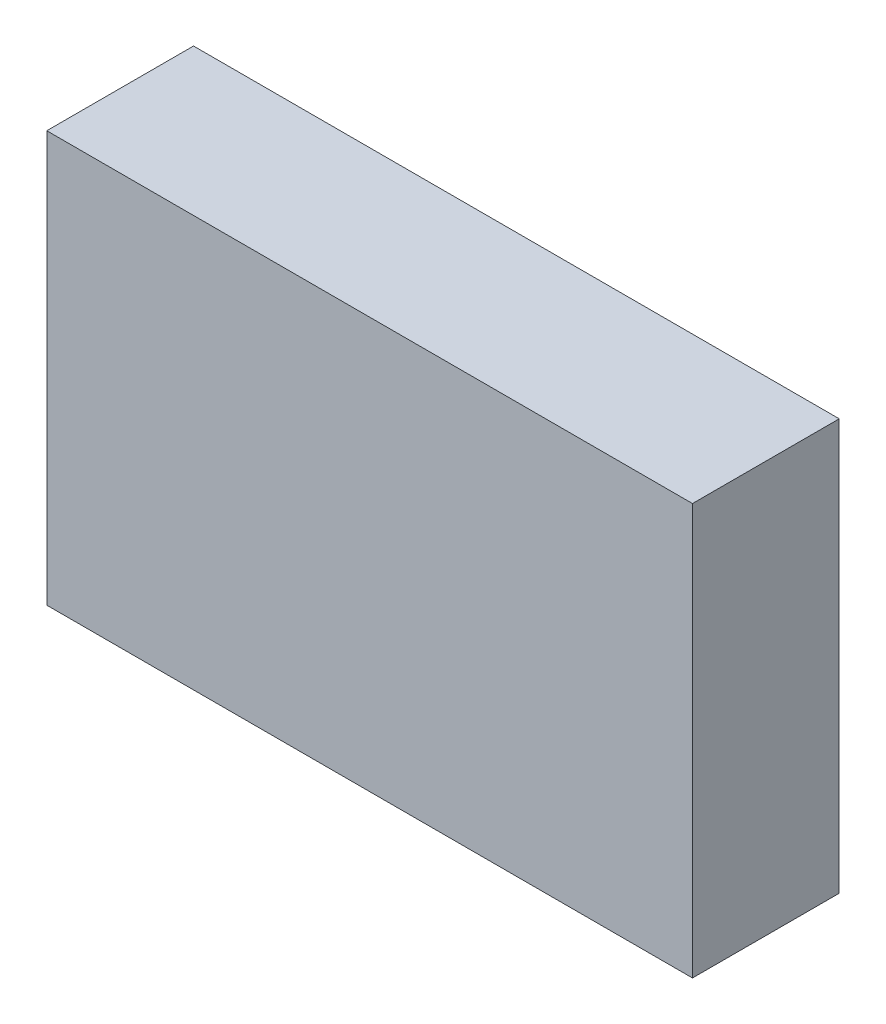
ISO-10303-21;
HEADER;
FILE_DESCRIPTION(('STEP AP214'),'2;1');
FILE_NAME('part.step','',(''),(''),'','','');
FILE_SCHEMA(('AUTOMOTIVE_DESIGN { 1 0 10303 214 1 1 1 1 }'));
ENDSEC;
DATA;
#1=APPLICATION_CONTEXT('core data for automotive mechanical design processes');
#2=APPLICATION_PROTOCOL_DEFINITION('international standard','automotive_design',2000,#1);
#3=PRODUCT_CONTEXT('',#1,'mechanical');
#4=PRODUCT('Part','Part','',(#3));
#5=PRODUCT_RELATED_PRODUCT_CATEGORY('part','',(#4));
#6=PRODUCT_DEFINITION_FORMATION('','',#4);
#7=PRODUCT_DEFINITION_CONTEXT('part definition',#1,'design');
#8=PRODUCT_DEFINITION('design','',#6,#7);
#9=PRODUCT_DEFINITION_SHAPE('','',#8);
#10=(LENGTH_UNIT() NAMED_UNIT(*) SI_UNIT(.MILLI.,.METRE.));
#11=(NAMED_UNIT(*) PLANE_ANGLE_UNIT() SI_UNIT($,.RADIAN.));
#12=(NAMED_UNIT(*) SI_UNIT($,.STERADIAN.) SOLID_ANGLE_UNIT());
#13=UNCERTAINTY_MEASURE_WITH_UNIT(LENGTH_MEASURE(1.E-05),#10,'distance_accuracy_value','');
#14=(GEOMETRIC_REPRESENTATION_CONTEXT(3) GLOBAL_UNCERTAINTY_ASSIGNED_CONTEXT((#13)) GLOBAL_UNIT_ASSIGNED_CONTEXT((#10,
#11,#12)) REPRESENTATION_CONTEXT('',''));
#15=CARTESIAN_POINT('',(0.,0.,0.));
#16=DIRECTION('',(0.,0.,1.));
#17=DIRECTION('',(1.,0.,0.));
#18=AXIS2_PLACEMENT_3D('',#15,#16,#17);
#19=CARTESIAN_POINT('',(-11.,-7.,5.));
#20=DIRECTION('',(0.,0.,1.));
#21=DIRECTION('',(1.,0.,0.));
#22=AXIS2_PLACEMENT_3D('',#19,#20,#21);
#23=PLANE('',#22);
#24=DIRECTION('',(0.,1.,0.));
#25=VECTOR('',#24,1.);
#26=CARTESIAN_POINT('',(-11.,-7.,5.));
#27=LINE('',#26,#25);
#28=CARTESIAN_POINT('',(-11.,-7.,5.));
#29=VERTEX_POINT('',#28);
#30=CARTESIAN_POINT('',(-11.,7.,5.));
#31=VERTEX_POINT('',#30);
#32=EDGE_CURVE('E87',#29,#31,#27,.T.);
#33=ORIENTED_EDGE('',*,*,#32,.F.);
#34=DIRECTION('',(1.,0.,0.));
#35=VECTOR('',#34,1.);
#36=CARTESIAN_POINT('',(-11.,-7.,5.));
#37=LINE('',#36,#35);
#38=CARTESIAN_POINT('',(11.,-7.,5.));
#39=VERTEX_POINT('',#38);
#40=EDGE_CURVE('E70',#29,#39,#37,.T.);
#41=ORIENTED_EDGE('',*,*,#40,.T.);
#42=DIRECTION('',(0.,1.,0.));
#43=VECTOR('',#42,1.);
#44=CARTESIAN_POINT('',(11.,-7.,5.));
#45=LINE('',#44,#43);
#46=CARTESIAN_POINT('',(11.,7.,5.));
#47=VERTEX_POINT('',#46);
#48=EDGE_CURVE('E81',#39,#47,#45,.T.);
#49=ORIENTED_EDGE('',*,*,#48,.T.);
#50=DIRECTION('',(1.,0.,0.));
#51=VECTOR('',#50,1.);
#52=CARTESIAN_POINT('',(-11.,7.,5.));
#53=LINE('',#52,#51);
#54=EDGE_CURVE('E9',#31,#47,#53,.T.);
#55=ORIENTED_EDGE('',*,*,#54,.F.);
#56=EDGE_LOOP('',(#33,#41,#49,#55));
#57=FACE_BOUND('',#56,.T.);
#58=ADVANCED_FACE('F14',(#57),#23,.T.);
#59=CARTESIAN_POINT('',(-11.,-7.,0.));
#60=DIRECTION('',(0.,0.,1.));
#61=DIRECTION('',(1.,0.,0.));
#62=AXIS2_PLACEMENT_3D('',#59,#60,#61);
#63=PLANE('',#62);
#64=DIRECTION('',(1.,0.,0.));
#65=VECTOR('',#64,1.);
#66=CARTESIAN_POINT('',(-11.,7.,0.));
#67=LINE('',#66,#65);
#68=CARTESIAN_POINT('',(-11.,7.,0.));
#69=VERTEX_POINT('',#68);
#70=CARTESIAN_POINT('',(11.,7.,0.));
#71=VERTEX_POINT('',#70);
#72=EDGE_CURVE('E23',#69,#71,#67,.T.);
#73=ORIENTED_EDGE('',*,*,#72,.T.);
#74=DIRECTION('',(0.,1.,0.));
#75=VECTOR('',#74,1.);
#76=CARTESIAN_POINT('',(11.,-7.,0.));
#77=LINE('',#76,#75);
#78=CARTESIAN_POINT('',(11.,-7.,0.));
#79=VERTEX_POINT('',#78);
#80=EDGE_CURVE('E102',#79,#71,#77,.T.);
#81=ORIENTED_EDGE('',*,*,#80,.F.);
#82=DIRECTION('',(1.,0.,0.));
#83=VECTOR('',#82,1.);
#84=CARTESIAN_POINT('',(-11.,-7.,0.));
#85=LINE('',#84,#83);
#86=CARTESIAN_POINT('',(-11.,-7.,0.));
#87=VERTEX_POINT('',#86);
#88=EDGE_CURVE('E49',#87,#79,#85,.T.);
#89=ORIENTED_EDGE('',*,*,#88,.F.);
#90=DIRECTION('',(0.,1.,0.));
#91=VECTOR('',#90,1.);
#92=CARTESIAN_POINT('',(-11.,-7.,0.));
#93=LINE('',#92,#91);
#94=EDGE_CURVE('E88',#87,#69,#93,.T.);
#95=ORIENTED_EDGE('',*,*,#94,.T.);
#96=EDGE_LOOP('',(#73,#81,#89,#95));
#97=FACE_BOUND('',#96,.T.);
#98=ADVANCED_FACE('F144',(#97),#63,.F.);
#99=CARTESIAN_POINT('',(-11.,7.,0.));
#100=DIRECTION('',(0.,1.,0.));
#101=DIRECTION('',(1.,0.,0.));
#102=AXIS2_PLACEMENT_3D('',#99,#100,#101);
#103=PLANE('',#102);
#104=ORIENTED_EDGE('',*,*,#72,.F.);
#105=DIRECTION('',(0.,0.,1.));
#106=VECTOR('',#105,1.);
#107=CARTESIAN_POINT('',(-11.,7.,0.));
#108=LINE('',#107,#106);
#109=EDGE_CURVE('E92',#69,#31,#108,.T.);
#110=ORIENTED_EDGE('',*,*,#109,.T.);
#111=ORIENTED_EDGE('',*,*,#54,.T.);
#112=DIRECTION('',(0.,0.,1.));
#113=VECTOR('',#112,1.);
#114=CARTESIAN_POINT('',(11.,7.,0.));
#115=LINE('',#114,#113);
#116=EDGE_CURVE('E105',#71,#47,#115,.T.);
#117=ORIENTED_EDGE('',*,*,#116,.F.);
#118=EDGE_LOOP('',(#104,#110,#111,#117));
#119=FACE_BOUND('',#118,.T.);
#120=ADVANCED_FACE('F142',(#119),#103,.T.);
#121=CARTESIAN_POINT('',(-11.,-7.,0.));
#122=DIRECTION('',(0.,1.,0.));
#123=DIRECTION('',(1.,0.,0.));
#124=AXIS2_PLACEMENT_3D('',#121,#122,#123);
#125=PLANE('',#124);
#126=DIRECTION('',(0.,0.,1.));
#127=VECTOR('',#126,1.);
#128=CARTESIAN_POINT('',(11.,-7.,0.));
#129=LINE('',#128,#127);
#130=EDGE_CURVE('E76',#79,#39,#129,.T.);
#131=ORIENTED_EDGE('',*,*,#130,.T.);
#132=ORIENTED_EDGE('',*,*,#40,.F.);
#133=DIRECTION('',(0.,0.,1.));
#134=VECTOR('',#133,1.);
#135=CARTESIAN_POINT('',(-11.,-7.,0.));
#136=LINE('',#135,#134);
#137=EDGE_CURVE('E73',#87,#29,#136,.T.);
#138=ORIENTED_EDGE('',*,*,#137,.F.);
#139=ORIENTED_EDGE('',*,*,#88,.T.);
#140=EDGE_LOOP('',(#131,#132,#138,#139));
#141=FACE_BOUND('',#140,.T.);
#142=ADVANCED_FACE('F72',(#141),#125,.F.);
#143=CARTESIAN_POINT('',(11.,-7.,0.));
#144=DIRECTION('',(1.,0.,0.));
#145=DIRECTION('',(0.,1.,0.));
#146=AXIS2_PLACEMENT_3D('',#143,#144,#145);
#147=PLANE('',#146);
#148=ORIENTED_EDGE('',*,*,#130,.F.);
#149=ORIENTED_EDGE('',*,*,#80,.T.);
#150=ORIENTED_EDGE('',*,*,#116,.T.);
#151=ORIENTED_EDGE('',*,*,#48,.F.);
#152=EDGE_LOOP('',(#148,#149,#150,#151));
#153=FACE_BOUND('',#152,.T.);
#154=ADVANCED_FACE('F141',(#153),#147,.T.);
#155=CARTESIAN_POINT('',(-11.,-7.,0.));
#156=DIRECTION('',(1.,0.,0.));
#157=DIRECTION('',(0.,1.,0.));
#158=AXIS2_PLACEMENT_3D('',#155,#156,#157);
#159=PLANE('',#158);
#160=ORIENTED_EDGE('',*,*,#32,.T.);
#161=ORIENTED_EDGE('',*,*,#109,.F.);
#162=ORIENTED_EDGE('',*,*,#94,.F.);
#163=ORIENTED_EDGE('',*,*,#137,.T.);
#164=EDGE_LOOP('',(#160,#161,#162,#163));
#165=FACE_BOUND('',#164,.T.);
#166=ADVANCED_FACE('F85',(#165),#159,.F.);
#167=CLOSED_SHELL('',(#58,#98,#120,#142,#154,#166));
#168=MANIFOLD_SOLID_BREP('B1',#167);
#169=ADVANCED_BREP_SHAPE_REPRESENTATION('',(#18,#168),#14);
#170=SHAPE_DEFINITION_REPRESENTATION(#9,#169);
ENDSEC;
END-ISO-10303-21;
